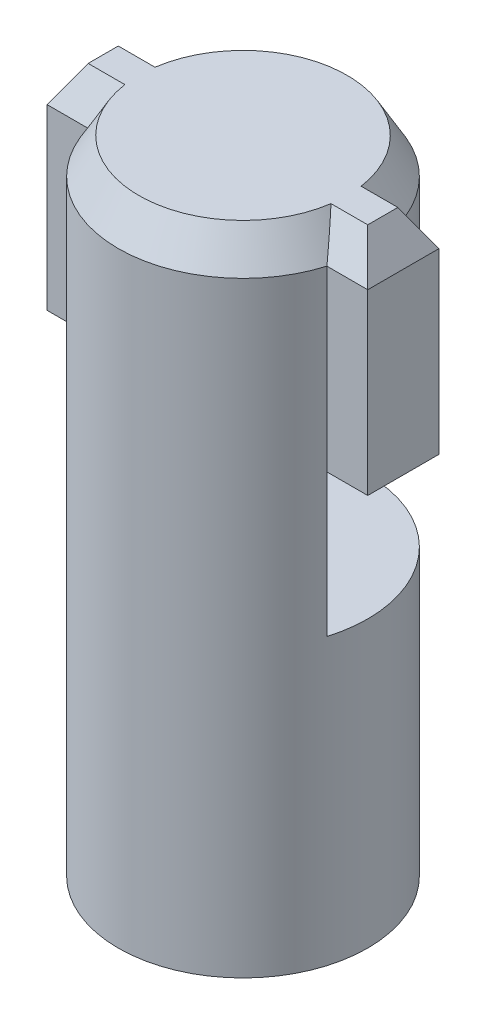
ISO-10303-21;
HEADER;
FILE_DESCRIPTION(('STEP AP214'),'2;1');
FILE_NAME('part.step','',(''),(''),'','','');
FILE_SCHEMA(('AUTOMOTIVE_DESIGN { 1 0 10303 214 1 1 1 1 }'));
ENDSEC;
DATA;
#1=APPLICATION_CONTEXT('core data for automotive mechanical design processes');
#2=APPLICATION_PROTOCOL_DEFINITION('international standard','automotive_design',2000,#1);
#3=PRODUCT_CONTEXT('',#1,'mechanical');
#4=PRODUCT('Part','Part','',(#3));
#5=PRODUCT_RELATED_PRODUCT_CATEGORY('part','',(#4));
#6=PRODUCT_DEFINITION_FORMATION('','',#4);
#7=PRODUCT_DEFINITION_CONTEXT('part definition',#1,'design');
#8=PRODUCT_DEFINITION('design','',#6,#7);
#9=PRODUCT_DEFINITION_SHAPE('','',#8);
#10=(LENGTH_UNIT() NAMED_UNIT(*) SI_UNIT(.MILLI.,.METRE.));
#11=(NAMED_UNIT(*) PLANE_ANGLE_UNIT() SI_UNIT($,.RADIAN.));
#12=(NAMED_UNIT(*) SI_UNIT($,.STERADIAN.) SOLID_ANGLE_UNIT());
#13=UNCERTAINTY_MEASURE_WITH_UNIT(LENGTH_MEASURE(1.E-05),#10,'distance_accuracy_value','');
#14=(GEOMETRIC_REPRESENTATION_CONTEXT(3) GLOBAL_UNCERTAINTY_ASSIGNED_CONTEXT((#13)) GLOBAL_UNIT_ASSIGNED_CONTEXT((#10,
#11,#12)) REPRESENTATION_CONTEXT('',''));
#15=CARTESIAN_POINT('',(0.,0.,0.));
#16=DIRECTION('',(0.,0.,1.));
#17=DIRECTION('',(1.,0.,0.));
#18=AXIS2_PLACEMENT_3D('',#15,#16,#17);
#19=CARTESIAN_POINT('',(0.,18.,0.));
#20=DIRECTION('',(0.,-1.,0.));
#21=DIRECTION('',(0.,0.,-1.));
#22=AXIS2_PLACEMENT_3D('',#19,#20,#21);
#23=CYLINDRICAL_SURFACE('',#22,3.5);
#24=DIRECTION('',(0.,-1.,0.));
#25=VECTOR('',#24,1.);
#26=CARTESIAN_POINT('',(-3.35410196624968,18.,-1.));
#27=LINE('',#26,#25);
#28=CARTESIAN_POINT('',(-3.35410196624968,12.,-1.));
#29=VERTEX_POINT('',#28);
#30=CARTESIAN_POINT('',(-3.35410196624968,17.,-1.));
#31=VERTEX_POINT('',#30);
#32=EDGE_CURVE('E191',#29,#31,#27,.F.);
#33=ORIENTED_EDGE('',*,*,#32,.T.);
#34=CARTESIAN_POINT('',(0.,17.,0.));
#35=DIRECTION('',(0.,1.,0.));
#36=DIRECTION('',(0.,0.,1.));
#37=AXIS2_PLACEMENT_3D('',#34,#35,#36);
#38=CIRCLE('',#37,3.5);
#39=CARTESIAN_POINT('',(3.35410196624968,17.,-1.));
#40=VERTEX_POINT('',#39);
#41=EDGE_CURVE('E224',#31,#40,#38,.F.);
#42=ORIENTED_EDGE('',*,*,#41,.T.);
#43=DIRECTION('',(0.,-1.,0.));
#44=VECTOR('',#43,1.);
#45=CARTESIAN_POINT('',(3.35410196624968,18.,-1.));
#46=LINE('',#45,#44);
#47=CARTESIAN_POINT('',(3.35410196624968,12.,-1.));
#48=VERTEX_POINT('',#47);
#49=EDGE_CURVE('E194',#40,#48,#46,.T.);
#50=ORIENTED_EDGE('',*,*,#49,.T.);
#51=CARTESIAN_POINT('',(0.,12.,0.));
#52=DIRECTION('',(0.,-1.,0.));
#53=DIRECTION('',(0.,0.,-1.));
#54=AXIS2_PLACEMENT_3D('',#51,#52,#53);
#55=CIRCLE('',#54,3.5);
#56=EDGE_CURVE('E170',#29,#48,#55,.T.);
#57=ORIENTED_EDGE('',*,*,#56,.F.);
#58=EDGE_LOOP('',(#33,#42,#50,#57));
#59=FACE_BOUND('',#58,.T.);
#60=ADVANCED_FACE('F34',(#59),#23,.T.);
#61=CARTESIAN_POINT('',(-4.5,8.,-1.));
#62=DIRECTION('',(-1.,0.,0.));
#63=DIRECTION('',(0.,0.,1.));
#64=AXIS2_PLACEMENT_3D('',#61,#62,#63);
#65=PLANE('',#64);
#66=DIRECTION('',(0.,1.,0.));
#67=VECTOR('',#66,1.);
#68=CARTESIAN_POINT('',(-4.5,8.,1.));
#69=LINE('',#68,#67);
#70=CARTESIAN_POINT('',(-4.5,12.,1.));
#71=VERTEX_POINT('',#70);
#72=CARTESIAN_POINT('',(-4.5,17.,1.));
#73=VERTEX_POINT('',#72);
#74=EDGE_CURVE('E180',#71,#73,#69,.T.);
#75=ORIENTED_EDGE('',*,*,#74,.T.);
#76=DIRECTION('',(0.,0.,-1.));
#77=VECTOR('',#76,1.);
#78=CARTESIAN_POINT('',(-4.5,17.,-1.));
#79=LINE('',#78,#77);
#80=CARTESIAN_POINT('',(-4.5,17.,-1.));
#81=VERTEX_POINT('',#80);
#82=EDGE_CURVE('E220',#73,#81,#79,.T.);
#83=ORIENTED_EDGE('',*,*,#82,.T.);
#84=DIRECTION('',(0.,1.,0.));
#85=VECTOR('',#84,1.);
#86=CARTESIAN_POINT('',(-4.5,8.,-1.));
#87=LINE('',#86,#85);
#88=CARTESIAN_POINT('',(-4.5,12.,-1.));
#89=VERTEX_POINT('',#88);
#90=EDGE_CURVE('E181',#89,#81,#87,.T.);
#91=ORIENTED_EDGE('',*,*,#90,.F.);
#92=DIRECTION('',(0.,0.,1.));
#93=VECTOR('',#92,1.);
#94=CARTESIAN_POINT('',(-4.5,12.,-1.));
#95=LINE('',#94,#93);
#96=EDGE_CURVE('E176',#89,#71,#95,.T.);
#97=ORIENTED_EDGE('',*,*,#96,.T.);
#98=EDGE_LOOP('',(#75,#83,#91,#97));
#99=FACE_BOUND('',#98,.T.);
#100=ADVANCED_FACE('F286',(#99),#65,.T.);
#101=CARTESIAN_POINT('',(4.5,8.,0.999999999999999));
#102=DIRECTION('',(0.,0.,1.));
#103=DIRECTION('',(1.,0.,0.));
#104=AXIS2_PLACEMENT_3D('',#101,#102,#103);
#105=PLANE('',#104);
#106=DIRECTION('',(0.,-1.,0.));
#107=VECTOR('',#106,1.);
#108=CARTESIAN_POINT('',(-3.35410196624968,18.,1.));
#109=LINE('',#108,#107);
#110=CARTESIAN_POINT('',(-3.35410196624968,17.,1.));
#111=VERTEX_POINT('',#110);
#112=CARTESIAN_POINT('',(-3.35410196624968,12.,1.));
#113=VERTEX_POINT('',#112);
#114=EDGE_CURVE('E156',#111,#113,#109,.T.);
#115=ORIENTED_EDGE('',*,*,#114,.F.);
#116=DIRECTION('',(-1.,0.,0.));
#117=VECTOR('',#116,1.);
#118=CARTESIAN_POINT('',(4.5,17.,0.999999999999999));
#119=LINE('',#118,#117);
#120=EDGE_CURVE('E217',#111,#73,#119,.T.);
#121=ORIENTED_EDGE('',*,*,#120,.T.);
#122=ORIENTED_EDGE('',*,*,#74,.F.);
#123=DIRECTION('',(-1.,0.,0.));
#124=VECTOR('',#123,1.);
#125=CARTESIAN_POINT('',(-5.,12.,1.));
#126=LINE('',#125,#124);
#127=EDGE_CURVE('E160',#113,#71,#126,.T.);
#128=ORIENTED_EDGE('',*,*,#127,.F.);
#129=EDGE_LOOP('',(#115,#121,#122,#128));
#130=FACE_BOUND('',#129,.T.);
#131=ADVANCED_FACE('F291',(#130),#105,.T.);
#132=CARTESIAN_POINT('',(4.5,8.,-1.));
#133=DIRECTION('',(0.,0.,-1.));
#134=DIRECTION('',(-1.,0.,0.));
#135=AXIS2_PLACEMENT_3D('',#132,#133,#134);
#136=PLANE('',#135);
#137=ORIENTED_EDGE('',*,*,#90,.T.);
#138=DIRECTION('',(1.,0.,0.));
#139=VECTOR('',#138,1.);
#140=CARTESIAN_POINT('',(4.5,17.,-1.));
#141=LINE('',#140,#139);
#142=EDGE_CURVE('E222',#81,#31,#141,.T.);
#143=ORIENTED_EDGE('',*,*,#142,.T.);
#144=ORIENTED_EDGE('',*,*,#32,.F.);
#145=DIRECTION('',(-1.,0.,0.));
#146=VECTOR('',#145,1.);
#147=CARTESIAN_POINT('',(4.5,12.,-1.));
#148=LINE('',#147,#146);
#149=EDGE_CURVE('E173',#29,#89,#148,.T.);
#150=ORIENTED_EDGE('',*,*,#149,.T.);
#151=EDGE_LOOP('',(#137,#143,#144,#150));
#152=FACE_BOUND('',#151,.T.);
#153=ADVANCED_FACE('F313',(#152),#136,.T.);
#154=ORIENTED_EDGE('',*,*,#49,.F.);
#155=DIRECTION('',(1.,0.,0.));
#156=VECTOR('',#155,1.);
#157=CARTESIAN_POINT('',(4.5,17.,-1.));
#158=LINE('',#157,#156);
#159=CARTESIAN_POINT('',(4.5,17.,-1.));
#160=VERTEX_POINT('',#159);
#161=EDGE_CURVE('E226',#40,#160,#158,.T.);
#162=ORIENTED_EDGE('',*,*,#161,.T.);
#163=DIRECTION('',(0.,1.,0.));
#164=VECTOR('',#163,1.);
#165=CARTESIAN_POINT('',(4.5,8.,-1.));
#166=LINE('',#165,#164);
#167=CARTESIAN_POINT('',(4.5,12.,-1.));
#168=VERTEX_POINT('',#167);
#169=EDGE_CURVE('E184',#168,#160,#166,.T.);
#170=ORIENTED_EDGE('',*,*,#169,.F.);
#171=DIRECTION('',(-1.,0.,0.));
#172=VECTOR('',#171,1.);
#173=CARTESIAN_POINT('',(4.5,12.,-1.));
#174=LINE('',#173,#172);
#175=EDGE_CURVE('E167',#168,#48,#174,.T.);
#176=ORIENTED_EDGE('',*,*,#175,.T.);
#177=EDGE_LOOP('',(#154,#162,#170,#176));
#178=FACE_BOUND('',#177,.T.);
#179=ADVANCED_FACE('F310',(#178),#136,.T.);
#180=DIRECTION('',(0.,1.,0.));
#181=VECTOR('',#180,1.);
#182=CARTESIAN_POINT('',(4.5,8.,0.999999999999999));
#183=LINE('',#182,#181);
#184=CARTESIAN_POINT('',(4.5,12.,1.));
#185=VERTEX_POINT('',#184);
#186=CARTESIAN_POINT('',(4.5,17.,0.999999999999999));
#187=VERTEX_POINT('',#186);
#188=EDGE_CURVE('E186',#185,#187,#183,.T.);
#189=ORIENTED_EDGE('',*,*,#188,.T.);
#190=DIRECTION('',(-1.,0.,0.));
#191=VECTOR('',#190,1.);
#192=CARTESIAN_POINT('',(4.5,17.,0.999999999999999));
#193=LINE('',#192,#191);
#194=CARTESIAN_POINT('',(3.35410196624968,17.,1.));
#195=VERTEX_POINT('',#194);
#196=EDGE_CURVE('E48',#187,#195,#193,.T.);
#197=ORIENTED_EDGE('',*,*,#196,.T.);
#198=DIRECTION('',(0.,-1.,0.));
#199=VECTOR('',#198,1.);
#200=CARTESIAN_POINT('',(3.35410196624968,18.,1.));
#201=LINE('',#200,#199);
#202=CARTESIAN_POINT('',(3.35410196624968,12.,1.));
#203=VERTEX_POINT('',#202);
#204=EDGE_CURVE('E157',#203,#195,#201,.F.);
#205=ORIENTED_EDGE('',*,*,#204,.F.);
#206=EDGE_CURVE('E163',#185,#203,#126,.T.);
#207=ORIENTED_EDGE('',*,*,#206,.F.);
#208=EDGE_LOOP('',(#189,#197,#205,#207));
#209=FACE_BOUND('',#208,.T.);
#210=ADVANCED_FACE('F305',(#209),#105,.T.);
#211=CARTESIAN_POINT('',(4.5,8.,-1.));
#212=DIRECTION('',(1.,0.,0.));
#213=DIRECTION('',(0.,0.,-1.));
#214=AXIS2_PLACEMENT_3D('',#211,#212,#213);
#215=PLANE('',#214);
#216=ORIENTED_EDGE('',*,*,#169,.T.);
#217=DIRECTION('',(0.,0.,1.));
#218=VECTOR('',#217,1.);
#219=CARTESIAN_POINT('',(4.5,17.,-1.));
#220=LINE('',#219,#218);
#221=EDGE_CURVE('E63',#160,#187,#220,.T.);
#222=ORIENTED_EDGE('',*,*,#221,.T.);
#223=ORIENTED_EDGE('',*,*,#188,.F.);
#224=DIRECTION('',(0.,0.,-1.));
#225=VECTOR('',#224,1.);
#226=CARTESIAN_POINT('',(4.5,12.,-1.));
#227=LINE('',#226,#225);
#228=EDGE_CURVE('E147',#185,#168,#227,.T.);
#229=ORIENTED_EDGE('',*,*,#228,.T.);
#230=EDGE_LOOP('',(#216,#222,#223,#229));
#231=FACE_BOUND('',#230,.T.);
#232=ADVANCED_FACE('F297',(#231),#215,.T.);
#233=ORIENTED_EDGE('',*,*,#204,.T.);
#234=CARTESIAN_POINT('',(0.,17.,0.));
#235=DIRECTION('',(0.,1.,0.));
#236=DIRECTION('',(0.,0.,1.));
#237=AXIS2_PLACEMENT_3D('',#234,#235,#236);
#238=CIRCLE('',#237,3.5);
#239=EDGE_CURVE('E11',#195,#111,#238,.F.);
#240=ORIENTED_EDGE('',*,*,#239,.T.);
#241=ORIENTED_EDGE('',*,*,#114,.T.);
#242=DIRECTION('',(0.,-1.,0.));
#243=VECTOR('',#242,1.);
#244=CARTESIAN_POINT('',(-3.35410196624968,18.,1.));
#245=LINE('',#244,#243);
#246=CARTESIAN_POINT('',(-3.35410196624968,8.,1.));
#247=VERTEX_POINT('',#246);
#248=EDGE_CURVE('E143',#113,#247,#245,.T.);
#249=ORIENTED_EDGE('',*,*,#248,.T.);
#250=CARTESIAN_POINT('',(0.,8.,0.));
#251=DIRECTION('',(0.,-1.,0.));
#252=DIRECTION('',(0.,0.,-1.));
#253=AXIS2_PLACEMENT_3D('',#250,#251,#252);
#254=CIRCLE('',#253,3.5);
#255=CARTESIAN_POINT('',(3.35410196624968,8.,1.));
#256=VERTEX_POINT('',#255);
#257=EDGE_CURVE('E137',#247,#256,#254,.T.);
#258=ORIENTED_EDGE('',*,*,#257,.T.);
#259=EDGE_CURVE('E141',#256,#203,#201,.F.);
#260=ORIENTED_EDGE('',*,*,#259,.T.);
#261=EDGE_LOOP('',(#233,#240,#241,#249,#258,#260));
#262=FACE_BOUND('',#261,.T.);
#263=CARTESIAN_POINT('',(0.,0.,0.));
#264=DIRECTION('',(0.,1.,0.));
#265=DIRECTION('',(0.,0.,1.));
#266=AXIS2_PLACEMENT_3D('',#263,#264,#265);
#267=CIRCLE('',#266,3.5);
#268=CARTESIAN_POINT('',(0.,0.,3.5));
#269=VERTEX_POINT('',#268);
#270=EDGE_CURVE('E148',#269,#269,#267,.T.);
#271=ORIENTED_EDGE('',*,*,#270,.T.);
#272=EDGE_LOOP('',(#271));
#273=FACE_BOUND('',#272,.T.);
#274=ADVANCED_FACE('F139',(#262,#273),#23,.T.);
#275=CARTESIAN_POINT('',(0.,18.,0.));
#276=DIRECTION('',(0.,1.,0.));
#277=DIRECTION('',(0.,0.,1.));
#278=AXIS2_PLACEMENT_3D('',#275,#276,#277);
#279=PLANE('',#278);
#280=DIRECTION('',(0.,0.,1.));
#281=VECTOR('',#280,1.);
#282=CARTESIAN_POINT('',(-3.92264973081037,18.,0.));
#283=LINE('',#282,#281);
#284=CARTESIAN_POINT('',(-3.92264973081037,18.,-0.422649730810368));
#285=VERTEX_POINT('',#284);
#286=CARTESIAN_POINT('',(-3.92264973081037,18.,0.422649730810368));
#287=VERTEX_POINT('',#286);
#288=EDGE_CURVE('E212',#285,#287,#283,.T.);
#289=ORIENTED_EDGE('',*,*,#288,.T.);
#290=DIRECTION('',(1.,0.,0.));
#291=VECTOR('',#290,1.);
#292=CARTESIAN_POINT('',(0.,18.,0.422649730810368));
#293=LINE('',#292,#291);
#294=CARTESIAN_POINT('',(-2.891928189643,18.,0.422649730810362));
#295=VERTEX_POINT('',#294);
#296=EDGE_CURVE('E214',#287,#295,#293,.T.);
#297=ORIENTED_EDGE('',*,*,#296,.T.);
#298=CARTESIAN_POINT('',(0.,18.,0.));
#299=DIRECTION('',(0.,1.,0.));
#300=DIRECTION('',(0.,0.,1.));
#301=AXIS2_PLACEMENT_3D('',#298,#299,#300);
#302=CIRCLE('',#301,2.92264973081037);
#303=CARTESIAN_POINT('',(2.891928189643,18.,0.422649730810361));
#304=VERTEX_POINT('',#303);
#305=EDGE_CURVE('E200',#295,#304,#302,.T.);
#306=ORIENTED_EDGE('',*,*,#305,.T.);
#307=DIRECTION('',(1.,0.,0.));
#308=VECTOR('',#307,1.);
#309=CARTESIAN_POINT('',(0.,18.,0.422649730810368));
#310=LINE('',#309,#308);
#311=CARTESIAN_POINT('',(3.92264973081037,18.,0.422649730810367));
#312=VERTEX_POINT('',#311);
#313=EDGE_CURVE('E202',#304,#312,#310,.T.);
#314=ORIENTED_EDGE('',*,*,#313,.T.);
#315=DIRECTION('',(0.,0.,-1.));
#316=VECTOR('',#315,1.);
#317=CARTESIAN_POINT('',(3.92264973081037,18.,0.));
#318=LINE('',#317,#316);
#319=CARTESIAN_POINT('',(3.92264973081037,18.,-0.422649730810369));
#320=VERTEX_POINT('',#319);
#321=EDGE_CURVE('E204',#312,#320,#318,.T.);
#322=ORIENTED_EDGE('',*,*,#321,.T.);
#323=DIRECTION('',(-1.,0.,0.));
#324=VECTOR('',#323,1.);
#325=CARTESIAN_POINT('',(0.,18.,-0.422649730810368));
#326=LINE('',#325,#324);
#327=CARTESIAN_POINT('',(2.891928189643,18.,-0.422649730810369));
#328=VERTEX_POINT('',#327);
#329=EDGE_CURVE('E206',#320,#328,#326,.T.);
#330=ORIENTED_EDGE('',*,*,#329,.T.);
#331=CARTESIAN_POINT('',(0.,18.,0.));
#332=DIRECTION('',(0.,1.,0.));
#333=DIRECTION('',(0.,0.,1.));
#334=AXIS2_PLACEMENT_3D('',#331,#332,#333);
#335=CIRCLE('',#334,2.92264973081037);
#336=CARTESIAN_POINT('',(-2.891928189643,18.,-0.422649730810361));
#337=VERTEX_POINT('',#336);
#338=EDGE_CURVE('E208',#328,#337,#335,.T.);
#339=ORIENTED_EDGE('',*,*,#338,.T.);
#340=DIRECTION('',(-1.,0.,0.));
#341=VECTOR('',#340,1.);
#342=CARTESIAN_POINT('',(0.,18.,-0.422649730810368));
#343=LINE('',#342,#341);
#344=EDGE_CURVE('E210',#337,#285,#343,.T.);
#345=ORIENTED_EDGE('',*,*,#344,.T.);
#346=EDGE_LOOP('',(#289,#297,#306,#314,#322,#330,#339,#345));
#347=FACE_BOUND('',#346,.T.);
#348=ADVANCED_FACE('F296',(#347),#279,.T.);
#349=CARTESIAN_POINT('',(0.,0.,0.));
#350=DIRECTION('',(0.,1.,0.));
#351=DIRECTION('',(0.,0.,1.));
#352=AXIS2_PLACEMENT_3D('',#349,#350,#351);
#353=PLANE('',#352);
#354=ORIENTED_EDGE('',*,*,#270,.F.);
#355=EDGE_LOOP('',(#354));
#356=FACE_BOUND('',#355,.T.);
#357=ADVANCED_FACE('F302',(#356),#353,.F.);
#358=CARTESIAN_POINT('',(-5.,12.,1.));
#359=DIRECTION('',(0.,0.,1.));
#360=DIRECTION('',(1.,0.,0.));
#361=AXIS2_PLACEMENT_3D('',#358,#359,#360);
#362=PLANE('',#361);
#363=EDGE_CURVE('E154',#203,#113,#126,.T.);
#364=ORIENTED_EDGE('',*,*,#363,.F.);
#365=ORIENTED_EDGE('',*,*,#259,.F.);
#366=DIRECTION('',(-1.,0.,0.));
#367=VECTOR('',#366,1.);
#368=CARTESIAN_POINT('',(-5.,8.,1.));
#369=LINE('',#368,#367);
#370=EDGE_CURVE('E152',#256,#247,#369,.T.);
#371=ORIENTED_EDGE('',*,*,#370,.T.);
#372=ORIENTED_EDGE('',*,*,#248,.F.);
#373=EDGE_LOOP('',(#364,#365,#371,#372));
#374=FACE_BOUND('',#373,.T.);
#375=ADVANCED_FACE('F151',(#374),#362,.F.);
#376=CARTESIAN_POINT('',(0.,12.,0.));
#377=DIRECTION('',(0.,-1.,0.));
#378=DIRECTION('',(0.,0.,-1.));
#379=AXIS2_PLACEMENT_3D('',#376,#377,#378);
#380=PLANE('',#379);
#381=ORIENTED_EDGE('',*,*,#149,.F.);
#382=ORIENTED_EDGE('',*,*,#56,.T.);
#383=ORIENTED_EDGE('',*,*,#175,.F.);
#384=ORIENTED_EDGE('',*,*,#228,.F.);
#385=ORIENTED_EDGE('',*,*,#206,.T.);
#386=ORIENTED_EDGE('',*,*,#363,.T.);
#387=ORIENTED_EDGE('',*,*,#127,.T.);
#388=ORIENTED_EDGE('',*,*,#96,.F.);
#389=EDGE_LOOP('',(#381,#382,#383,#384,#385,#386,#387,#388));
#390=FACE_BOUND('',#389,.T.);
#391=ADVANCED_FACE('F322',(#390),#380,.T.);
#392=CARTESIAN_POINT('',(0.,8.,0.));
#393=DIRECTION('',(0.,-1.,0.));
#394=DIRECTION('',(0.,0.,-1.));
#395=AXIS2_PLACEMENT_3D('',#392,#393,#394);
#396=PLANE('',#395);
#397=ORIENTED_EDGE('',*,*,#370,.F.);
#398=ORIENTED_EDGE('',*,*,#257,.F.);
#399=EDGE_LOOP('',(#397,#398));
#400=FACE_BOUND('',#399,.T.);
#401=ADVANCED_FACE('F159',(#400),#396,.F.);
#402=CARTESIAN_POINT('',(0.,18.,-0.422649730810368));
#403=DIRECTION('',(0.,-0.499999999999998,0.86602540378444));
#404=DIRECTION('',(-1.,0.,0.));
#405=AXIS2_PLACEMENT_3D('',#402,#403,#404);
#406=PLANE('',#405);
#407=DIRECTION('',(-0.447213595499956,0.774596669241485,0.447213595499957));
#408=VECTOR('',#407,1.);
#409=CARTESIAN_POINT('',(3.83811978464829,18.1464101615138,-0.338119784648296));
#410=LINE('',#409,#408);
#411=EDGE_CURVE('E165',#160,#320,#410,.T.);
#412=ORIENTED_EDGE('',*,*,#411,.F.);
#413=ORIENTED_EDGE('',*,*,#161,.F.);
#414=CARTESIAN_POINT('',(3.35410196624968,17.,-1.));
#415=CARTESIAN_POINT('',(3.31789876279821,17.0841225359634,-0.951431831216601));
#416=CARTESIAN_POINT('',(3.28118510315563,17.1680814693473,-0.902958118426541));
#417=CARTESIAN_POINT('',(3.20664393840968,17.3356117830366,-0.806234446720612));
#418=CARTESIAN_POINT('',(3.16881661552825,17.4191832241831,-0.757984452678081));
#419=CARTESIAN_POINT('',(3.09194204926259,17.5859087019816,-0.661725453190358));
#420=CARTESIAN_POINT('',(3.05289476073218,17.669062723054,-0.613716456740038));
#421=CARTESIAN_POINT('',(2.97345206026992,17.8349019365773,-0.517969142170157));
#422=CARTESIAN_POINT('',(2.93305642980277,17.9175870504635,-0.470230869409975));
#423=CARTESIAN_POINT('',(2.891928189643,18.,-0.422649730810368));
#424=B_SPLINE_CURVE_WITH_KNOTS('',3,(#414,#415,#416,#417,#418,#419,#420,#421,#422,#423),
.UNSPECIFIED.,.F.,.F.,(4,2,2,2,4),(0.,0.310991130380704,0.621931654926695,0.932883699835558,
1.24388639002683),.UNSPECIFIED.);
#425=EDGE_CURVE('E39',#328,#40,#424,.F.);
#426=ORIENTED_EDGE('',*,*,#425,.F.);
#427=ORIENTED_EDGE('',*,*,#329,.F.);
#428=EDGE_LOOP('',(#412,#413,#426,#427));
#429=FACE_BOUND('',#428,.T.);
#430=ADVANCED_FACE('F36',(#429),#406,.F.);
#431=CARTESIAN_POINT('',(0.,18.,0.));
#432=DIRECTION('',(0.,-1.,0.));
#433=DIRECTION('',(0.,0.,-1.));
#434=AXIS2_PLACEMENT_3D('',#431,#432,#433);
#435=CONICAL_SURFACE('',#434,2.92264973081037,0.523598775598297);
#436=ORIENTED_EDGE('',*,*,#425,.T.);
#437=ORIENTED_EDGE('',*,*,#41,.F.);
#438=CARTESIAN_POINT('',(-3.35410196624968,17.,-1.));
#439=CARTESIAN_POINT('',(-3.31789876279821,17.0841225359634,-0.951431831216601));
#440=CARTESIAN_POINT('',(-3.28118510315563,17.1680814693473,-0.902958118426541));
#441=CARTESIAN_POINT('',(-3.20664393840968,17.3356117830366,-0.806234446720613));
#442=CARTESIAN_POINT('',(-3.16881661552825,17.4191832241831,-0.757984452678084));
#443=CARTESIAN_POINT('',(-3.0919420492626,17.5859087019816,-0.661725453190362));
#444=CARTESIAN_POINT('',(-3.05289476073218,17.669062723054,-0.613716456740043));
#445=CARTESIAN_POINT('',(-2.97345206026993,17.8349019365773,-0.517969142170163));
#446=CARTESIAN_POINT('',(-2.93305642980278,17.9175870504635,-0.470230869409981));
#447=CARTESIAN_POINT('',(-2.89192818964301,18.,-0.422649730810376));
#448=B_SPLINE_CURVE_WITH_KNOTS('',3,(#438,#439,#440,#441,#442,#443,#444,#445,#446,#447),
.UNSPECIFIED.,.F.,.F.,(4,2,2,2,4),(0.,0.310991130380704,0.621931654926687,0.932883699835545,
1.24388639002681),.UNSPECIFIED.);
#449=EDGE_CURVE('E264',#337,#31,#448,.F.);
#450=ORIENTED_EDGE('',*,*,#449,.F.);
#451=ORIENTED_EDGE('',*,*,#338,.F.);
#452=EDGE_LOOP('',(#436,#437,#450,#451));
#453=FACE_BOUND('',#452,.T.);
#454=ADVANCED_FACE('F272',(#453),#435,.T.);
#455=CARTESIAN_POINT('',(3.92264973081037,18.,0.));
#456=DIRECTION('',(-0.86602540378444,-0.499999999999998,0.));
#457=DIRECTION('',(0.,0.,-1.));
#458=AXIS2_PLACEMENT_3D('',#455,#456,#457);
#459=PLANE('',#458);
#460=ORIENTED_EDGE('',*,*,#411,.T.);
#461=ORIENTED_EDGE('',*,*,#321,.F.);
#462=DIRECTION('',(-0.447213595499956,0.774596669241485,-0.447213595499957));
#463=VECTOR('',#462,1.);
#464=CARTESIAN_POINT('',(3.1381197846483,19.358845726812,-0.361880215351702));
#465=LINE('',#464,#463);
#466=EDGE_CURVE('E261',#187,#312,#465,.T.);
#467=ORIENTED_EDGE('',*,*,#466,.F.);
#468=ORIENTED_EDGE('',*,*,#221,.F.);
#469=EDGE_LOOP('',(#460,#461,#467,#468));
#470=FACE_BOUND('',#469,.T.);
#471=ADVANCED_FACE('F275',(#470),#459,.F.);
#472=CARTESIAN_POINT('',(0.,18.,-0.422649730810368));
#473=DIRECTION('',(0.,-0.499999999999999,0.86602540378444));
#474=DIRECTION('',(-1.,0.,0.));
#475=AXIS2_PLACEMENT_3D('',#472,#473,#474);
#476=PLANE('',#475);
#477=ORIENTED_EDGE('',*,*,#449,.T.);
#478=ORIENTED_EDGE('',*,*,#142,.F.);
#479=DIRECTION('',(0.447213595499956,0.774596669241485,0.447213595499957));
#480=VECTOR('',#479,1.);
#481=CARTESIAN_POINT('',(-3.1381197846483,19.358845726812,0.361880215351701));
#482=LINE('',#481,#480);
#483=EDGE_CURVE('E258',#285,#81,#482,.F.);
#484=ORIENTED_EDGE('',*,*,#483,.F.);
#485=ORIENTED_EDGE('',*,*,#344,.F.);
#486=EDGE_LOOP('',(#477,#478,#484,#485));
#487=FACE_BOUND('',#486,.T.);
#488=ADVANCED_FACE('F270',(#487),#476,.F.);
#489=CARTESIAN_POINT('',(0.,18.,0.422649730810368));
#490=DIRECTION('',(0.,-0.499999999999999,-0.86602540378444));
#491=DIRECTION('',(1.,0.,0.));
#492=AXIS2_PLACEMENT_3D('',#489,#490,#491);
#493=PLANE('',#492);
#494=ORIENTED_EDGE('',*,*,#466,.T.);
#495=ORIENTED_EDGE('',*,*,#313,.F.);
#496=CARTESIAN_POINT('',(3.35410196624968,17.,1.));
#497=CARTESIAN_POINT('',(3.31789876279821,17.0841225359634,0.9514318312166));
#498=CARTESIAN_POINT('',(3.28118510315563,17.1680814693473,0.90295811842654));
#499=CARTESIAN_POINT('',(3.20664393840968,17.3356117830366,0.806234446720612));
#500=CARTESIAN_POINT('',(3.16881661552825,17.4191832241831,0.757984452678083));
#501=CARTESIAN_POINT('',(3.0919420492626,17.5859087019816,0.661725453190361));
#502=CARTESIAN_POINT('',(3.05289476073218,17.669062723054,0.613716456740042));
#503=CARTESIAN_POINT('',(2.97345206026993,17.8349019365773,0.517969142170163));
#504=CARTESIAN_POINT('',(2.93305642980278,17.9175870504635,0.470230869409981));
#505=CARTESIAN_POINT('',(2.89192818964301,18.,0.422649730810375));
#506=B_SPLINE_CURVE_WITH_KNOTS('',3,(#496,#497,#498,#499,#500,#501,#502,#503,#504,#505),
.UNSPECIFIED.,.F.,.F.,(4,2,2,2,4),(0.,0.310991130380704,0.621931654926687,0.932883699835545,
1.24388639002681),.UNSPECIFIED.);
#507=EDGE_CURVE('E252',#195,#304,#506,.T.);
#508=ORIENTED_EDGE('',*,*,#507,.F.);
#509=ORIENTED_EDGE('',*,*,#196,.F.);
#510=EDGE_LOOP('',(#494,#495,#508,#509));
#511=FACE_BOUND('',#510,.T.);
#512=ADVANCED_FACE('F248',(#511),#493,.F.);
#513=CARTESIAN_POINT('',(-3.92264973081037,18.,0.));
#514=DIRECTION('',(0.86602540378444,-0.499999999999998,0.));
#515=DIRECTION('',(0.,0.,1.));
#516=AXIS2_PLACEMENT_3D('',#513,#514,#515);
#517=PLANE('',#516);
#518=ORIENTED_EDGE('',*,*,#483,.T.);
#519=ORIENTED_EDGE('',*,*,#82,.F.);
#520=DIRECTION('',(0.447213595499956,0.774596669241485,-0.447213595499957));
#521=VECTOR('',#520,1.);
#522=CARTESIAN_POINT('',(-3.8381197846483,18.1464101615138,0.338119784648296));
#523=LINE('',#522,#521);
#524=EDGE_CURVE('E237',#287,#73,#523,.F.);
#525=ORIENTED_EDGE('',*,*,#524,.F.);
#526=ORIENTED_EDGE('',*,*,#288,.F.);
#527=EDGE_LOOP('',(#518,#519,#525,#526));
#528=FACE_BOUND('',#527,.T.);
#529=ADVANCED_FACE('F246',(#528),#517,.F.);
#530=CARTESIAN_POINT('',(0.,18.,0.));
#531=DIRECTION('',(0.,-1.,0.));
#532=DIRECTION('',(0.,0.,-1.));
#533=AXIS2_PLACEMENT_3D('',#530,#531,#532);
#534=CONICAL_SURFACE('',#533,2.92264973081037,0.523598775598297);
#535=ORIENTED_EDGE('',*,*,#507,.T.);
#536=ORIENTED_EDGE('',*,*,#305,.F.);
#537=CARTESIAN_POINT('',(-2.89192818964305,18.,0.422649730810368));
#538=CARTESIAN_POINT('',(-2.93305642980279,17.9175870504635,0.470230869409978));
#539=CARTESIAN_POINT('',(-2.97345206026993,17.8349019365773,0.517969142170162));
#540=CARTESIAN_POINT('',(-3.05289476073218,17.669062723054,0.613716456740043));
#541=CARTESIAN_POINT('',(-3.0919420492626,17.5859087019816,0.661725453190362));
#542=CARTESIAN_POINT('',(-3.16881661552825,17.4191832241831,0.757984452678084));
#543=CARTESIAN_POINT('',(-3.20664393840968,17.3356117830366,0.806234446720614));
#544=CARTESIAN_POINT('',(-3.28118510315563,17.1680814693473,0.902958118426542));
#545=CARTESIAN_POINT('',(-3.31789876279821,17.0841225359634,0.951431831216602));
#546=CARTESIAN_POINT('',(-3.35410196624968,17.,1.));
#547=B_SPLINE_CURVE_WITH_KNOTS('',3,(#537,#538,#539,#540,#541,#542,#543,#544,#545,#546),
.UNSPECIFIED.,.F.,.F.,(4,2,2,2,4),(0.,0.311002690191268,0.621954735100127,0.932895259646115,
1.24388639002681),.UNSPECIFIED.);
#548=EDGE_CURVE('E230',#111,#295,#547,.F.);
#549=ORIENTED_EDGE('',*,*,#548,.F.);
#550=ORIENTED_EDGE('',*,*,#239,.F.);
#551=EDGE_LOOP('',(#535,#536,#549,#550));
#552=FACE_BOUND('',#551,.T.);
#553=ADVANCED_FACE('F242',(#552),#534,.T.);
#554=CARTESIAN_POINT('',(0.,18.,0.422649730810368));
#555=DIRECTION('',(0.,-0.499999999999998,-0.86602540378444));
#556=DIRECTION('',(1.,0.,0.));
#557=AXIS2_PLACEMENT_3D('',#554,#555,#556);
#558=PLANE('',#557);
#559=ORIENTED_EDGE('',*,*,#524,.T.);
#560=ORIENTED_EDGE('',*,*,#120,.F.);
#561=ORIENTED_EDGE('',*,*,#548,.T.);
#562=ORIENTED_EDGE('',*,*,#296,.F.);
#563=EDGE_LOOP('',(#559,#560,#561,#562));
#564=FACE_BOUND('',#563,.T.);
#565=ADVANCED_FACE('F239',(#564),#558,.F.);
#566=CLOSED_SHELL('',(#60,#100,#131,#153,#179,#210,#232,#274,#348,#357,#375,#391,#401,#430,#454,
#471,#488,#512,#529,#553,#565));
#567=MANIFOLD_SOLID_BREP('B2',#566);
#568=ADVANCED_BREP_SHAPE_REPRESENTATION('',(#18,#567),#14);
#569=SHAPE_DEFINITION_REPRESENTATION(#9,#568);
ENDSEC;
END-ISO-10303-21;
